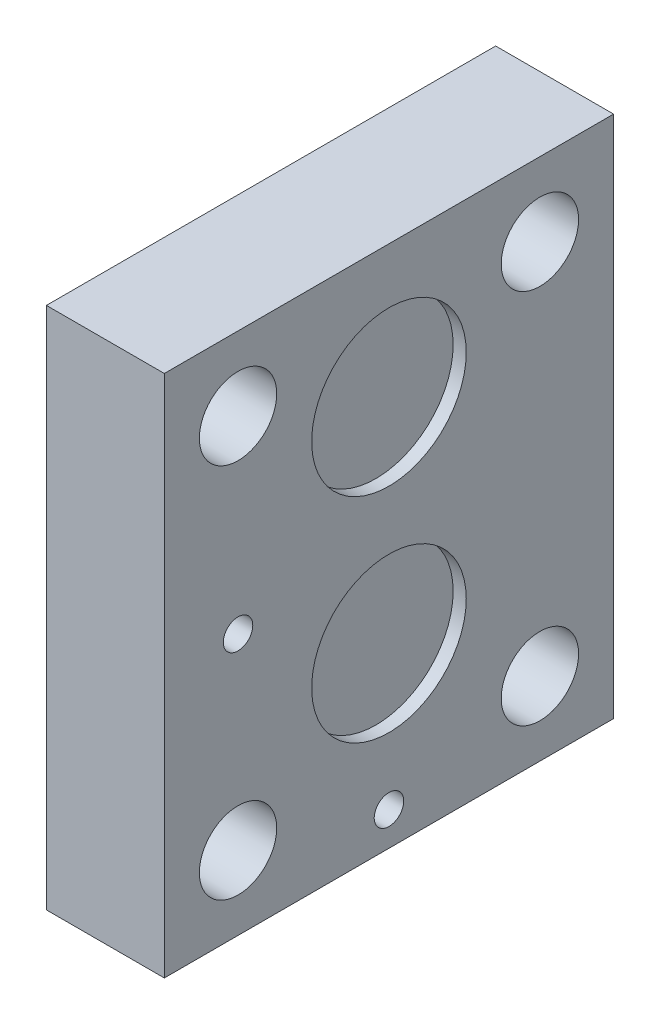
ISO-10303-21;
HEADER;
FILE_DESCRIPTION(('STEP AP214'),'2;1');
FILE_NAME('part.step','',(''),(''),'','','');
FILE_SCHEMA(('AUTOMOTIVE_DESIGN { 1 0 10303 214 1 1 1 1 }'));
ENDSEC;
DATA;
#1=APPLICATION_CONTEXT('core data for automotive mechanical design processes');
#2=APPLICATION_PROTOCOL_DEFINITION('international standard','automotive_design',2000,#1);
#3=PRODUCT_CONTEXT('',#1,'mechanical');
#4=PRODUCT('Part','Part','',(#3));
#5=PRODUCT_RELATED_PRODUCT_CATEGORY('part','',(#4));
#6=PRODUCT_DEFINITION_FORMATION('','',#4);
#7=PRODUCT_DEFINITION_CONTEXT('part definition',#1,'design');
#8=PRODUCT_DEFINITION('design','',#6,#7);
#9=PRODUCT_DEFINITION_SHAPE('','',#8);
#10=(LENGTH_UNIT() NAMED_UNIT(*) SI_UNIT(.MILLI.,.METRE.));
#11=(NAMED_UNIT(*) PLANE_ANGLE_UNIT() SI_UNIT($,.RADIAN.));
#12=(NAMED_UNIT(*) SI_UNIT($,.STERADIAN.) SOLID_ANGLE_UNIT());
#13=UNCERTAINTY_MEASURE_WITH_UNIT(LENGTH_MEASURE(1.E-05),#10,'distance_accuracy_value','');
#14=(GEOMETRIC_REPRESENTATION_CONTEXT(3) GLOBAL_UNCERTAINTY_ASSIGNED_CONTEXT((#13)) GLOBAL_UNIT_ASSIGNED_CONTEXT((#10,
#11,#12)) REPRESENTATION_CONTEXT('',''));
#15=CARTESIAN_POINT('',(0.,0.,0.));
#16=DIRECTION('',(0.,0.,1.));
#17=DIRECTION('',(1.,0.,0.));
#18=AXIS2_PLACEMENT_3D('',#15,#16,#17);
#19=CARTESIAN_POINT('',(25.4,0.,0.));
#20=DIRECTION('',(0.,1.,0.));
#21=DIRECTION('',(0.,0.,1.));
#22=AXIS2_PLACEMENT_3D('',#19,#20,#21);
#23=PLANE('',#22);
#24=DIRECTION('',(0.,0.,-1.));
#25=VECTOR('',#24,1.);
#26=CARTESIAN_POINT('',(0.,0.,0.));
#27=LINE('',#26,#25);
#28=CARTESIAN_POINT('',(0.,0.,96.774));
#29=VERTEX_POINT('',#28);
#30=CARTESIAN_POINT('',(0.,0.,0.));
#31=VERTEX_POINT('',#30);
#32=EDGE_CURVE('E106',#29,#31,#27,.T.);
#33=ORIENTED_EDGE('',*,*,#32,.T.);
#34=DIRECTION('',(-1.,0.,0.));
#35=VECTOR('',#34,1.);
#36=CARTESIAN_POINT('',(25.4,0.,0.));
#37=LINE('',#36,#35);
#38=CARTESIAN_POINT('',(25.4,0.,0.));
#39=VERTEX_POINT('',#38);
#40=EDGE_CURVE('E11',#39,#31,#37,.T.);
#41=ORIENTED_EDGE('',*,*,#40,.F.);
#42=DIRECTION('',(0.,0.,-1.));
#43=VECTOR('',#42,1.);
#44=CARTESIAN_POINT('',(25.4,0.,0.));
#45=LINE('',#44,#43);
#46=CARTESIAN_POINT('',(25.4,0.,96.774));
#47=VERTEX_POINT('',#46);
#48=EDGE_CURVE('E94',#47,#39,#45,.T.);
#49=ORIENTED_EDGE('',*,*,#48,.F.);
#50=DIRECTION('',(-1.,0.,0.));
#51=VECTOR('',#50,1.);
#52=CARTESIAN_POINT('',(25.4,0.,96.774));
#53=LINE('',#52,#51);
#54=EDGE_CURVE('E102',#47,#29,#53,.T.);
#55=ORIENTED_EDGE('',*,*,#54,.T.);
#56=EDGE_LOOP('',(#33,#41,#49,#55));
#57=FACE_BOUND('',#56,.T.);
#58=ADVANCED_FACE('F43',(#57),#23,.F.);
#59=CARTESIAN_POINT('',(25.4,0.,0.));
#60=DIRECTION('',(0.,0.,1.));
#61=DIRECTION('',(1.,0.,0.));
#62=AXIS2_PLACEMENT_3D('',#59,#60,#61);
#63=PLANE('',#62);
#64=DIRECTION('',(0.,1.,0.));
#65=VECTOR('',#64,1.);
#66=CARTESIAN_POINT('',(0.,0.,0.));
#67=LINE('',#66,#65);
#68=CARTESIAN_POINT('',(0.,112.776,0.));
#69=VERTEX_POINT('',#68);
#70=EDGE_CURVE('E98',#31,#69,#67,.T.);
#71=ORIENTED_EDGE('',*,*,#70,.T.);
#72=DIRECTION('',(-1.,0.,0.));
#73=VECTOR('',#72,1.);
#74=CARTESIAN_POINT('',(25.4,112.776,0.));
#75=LINE('',#74,#73);
#76=CARTESIAN_POINT('',(25.4,112.776,0.));
#77=VERTEX_POINT('',#76);
#78=EDGE_CURVE('E51',#77,#69,#75,.T.);
#79=ORIENTED_EDGE('',*,*,#78,.F.);
#80=DIRECTION('',(0.,1.,0.));
#81=VECTOR('',#80,1.);
#82=CARTESIAN_POINT('',(25.4,0.,0.));
#83=LINE('',#82,#81);
#84=EDGE_CURVE('E89',#39,#77,#83,.T.);
#85=ORIENTED_EDGE('',*,*,#84,.F.);
#86=ORIENTED_EDGE('',*,*,#40,.T.);
#87=EDGE_LOOP('',(#71,#79,#85,#86));
#88=FACE_BOUND('',#87,.T.);
#89=ADVANCED_FACE('F97',(#88),#63,.F.);
#90=CARTESIAN_POINT('',(25.4,112.776,0.));
#91=DIRECTION('',(0.,-1.,0.));
#92=DIRECTION('',(0.,0.,-1.));
#93=AXIS2_PLACEMENT_3D('',#90,#91,#92);
#94=PLANE('',#93);
#95=DIRECTION('',(0.,0.,1.));
#96=VECTOR('',#95,1.);
#97=CARTESIAN_POINT('',(0.,112.776,0.));
#98=LINE('',#97,#96);
#99=CARTESIAN_POINT('',(0.,112.776,96.774));
#100=VERTEX_POINT('',#99);
#101=EDGE_CURVE('E76',#69,#100,#98,.T.);
#102=ORIENTED_EDGE('',*,*,#101,.T.);
#103=DIRECTION('',(-1.,0.,0.));
#104=VECTOR('',#103,1.);
#105=CARTESIAN_POINT('',(25.4,112.776,96.774));
#106=LINE('',#105,#104);
#107=CARTESIAN_POINT('',(25.4,112.776,96.774));
#108=VERTEX_POINT('',#107);
#109=EDGE_CURVE('E99',#108,#100,#106,.T.);
#110=ORIENTED_EDGE('',*,*,#109,.F.);
#111=DIRECTION('',(0.,0.,1.));
#112=VECTOR('',#111,1.);
#113=CARTESIAN_POINT('',(25.4,112.776,0.));
#114=LINE('',#113,#112);
#115=EDGE_CURVE('E92',#77,#108,#114,.T.);
#116=ORIENTED_EDGE('',*,*,#115,.F.);
#117=ORIENTED_EDGE('',*,*,#78,.T.);
#118=EDGE_LOOP('',(#102,#110,#116,#117));
#119=FACE_BOUND('',#118,.T.);
#120=ADVANCED_FACE('F100',(#119),#94,.F.);
#121=CARTESIAN_POINT('',(25.4,0.,96.774));
#122=DIRECTION('',(0.,0.,-1.));
#123=DIRECTION('',(-1.,0.,0.));
#124=AXIS2_PLACEMENT_3D('',#121,#122,#123);
#125=PLANE('',#124);
#126=DIRECTION('',(0.,-1.,0.));
#127=VECTOR('',#126,1.);
#128=CARTESIAN_POINT('',(0.,0.,96.774));
#129=LINE('',#128,#127);
#130=EDGE_CURVE('E82',#100,#29,#129,.T.);
#131=ORIENTED_EDGE('',*,*,#130,.T.);
#132=ORIENTED_EDGE('',*,*,#54,.F.);
#133=DIRECTION('',(0.,-1.,0.));
#134=VECTOR('',#133,1.);
#135=CARTESIAN_POINT('',(25.4,0.,96.774));
#136=LINE('',#135,#134);
#137=EDGE_CURVE('E59',#108,#47,#136,.T.);
#138=ORIENTED_EDGE('',*,*,#137,.F.);
#139=ORIENTED_EDGE('',*,*,#109,.T.);
#140=EDGE_LOOP('',(#131,#132,#138,#139));
#141=FACE_BOUND('',#140,.T.);
#142=ADVANCED_FACE('F114',(#141),#125,.F.);
#143=CARTESIAN_POINT('',(25.4,0.,0.));
#144=DIRECTION('',(-1.,0.,0.));
#145=DIRECTION('',(0.,0.,1.));
#146=AXIS2_PLACEMENT_3D('',#143,#144,#145);
#147=PLANE('',#146);
#148=CARTESIAN_POINT('',(25.4,84.201,48.387));
#149=DIRECTION('',(1.,0.,0.));
#150=DIRECTION('',(0.,0.,-1.));
#151=AXIS2_PLACEMENT_3D('',#148,#149,#150);
#152=CIRCLE('',#151,16.6497);
#153=CARTESIAN_POINT('',(25.4,84.201,31.7373));
#154=VERTEX_POINT('',#153);
#155=EDGE_CURVE('E174',#154,#154,#152,.T.);
#156=ORIENTED_EDGE('',*,*,#155,.F.);
#157=EDGE_LOOP('',(#156));
#158=FACE_BOUND('',#157,.T.);
#159=CARTESIAN_POINT('',(25.4,38.227,48.387));
#160=DIRECTION('',(1.,0.,0.));
#161=DIRECTION('',(0.,0.,-1.));
#162=AXIS2_PLACEMENT_3D('',#159,#160,#161);
#163=CIRCLE('',#162,16.6497);
#164=CARTESIAN_POINT('',(25.4,38.227,31.7373));
#165=VERTEX_POINT('',#164);
#166=EDGE_CURVE('E168',#165,#165,#163,.T.);
#167=ORIENTED_EDGE('',*,*,#166,.F.);
#168=EDGE_LOOP('',(#167));
#169=FACE_BOUND('',#168,.T.);
#170=CARTESIAN_POINT('',(25.4,56.261,80.899));
#171=DIRECTION('',(1.,0.,0.));
#172=DIRECTION('',(0.,0.,-1.));
#173=AXIS2_PLACEMENT_3D('',#170,#171,#172);
#174=CIRCLE('',#173,3.175);
#175=CARTESIAN_POINT('',(25.4,56.261,77.724));
#176=VERTEX_POINT('',#175);
#177=EDGE_CURVE('E162',#176,#176,#174,.T.);
#178=ORIENTED_EDGE('',*,*,#177,.F.);
#179=EDGE_LOOP('',(#178));
#180=FACE_BOUND('',#179,.T.);
#181=CARTESIAN_POINT('',(25.4,7.239,48.387));
#182=DIRECTION('',(1.,0.,0.));
#183=DIRECTION('',(0.,0.,-1.));
#184=AXIS2_PLACEMENT_3D('',#181,#182,#183);
#185=CIRCLE('',#184,3.175);
#186=CARTESIAN_POINT('',(25.4,7.239,45.212));
#187=VERTEX_POINT('',#186);
#188=EDGE_CURVE('E156',#187,#187,#185,.T.);
#189=ORIENTED_EDGE('',*,*,#188,.F.);
#190=EDGE_LOOP('',(#189));
#191=FACE_BOUND('',#190,.T.);
#192=CARTESIAN_POINT('',(25.4,96.901,15.875));
#193=DIRECTION('',(1.,0.,0.));
#194=DIRECTION('',(0.,0.,-1.));
#195=AXIS2_PLACEMENT_3D('',#192,#193,#194);
#196=CIRCLE('',#195,8.334375);
#197=CARTESIAN_POINT('',(25.4,96.901,7.540625));
#198=VERTEX_POINT('',#197);
#199=EDGE_CURVE('E123',#198,#198,#196,.T.);
#200=ORIENTED_EDGE('',*,*,#199,.F.);
#201=EDGE_LOOP('',(#200));
#202=FACE_BOUND('',#201,.T.);
#203=CARTESIAN_POINT('',(25.4,15.875,80.899));
#204=DIRECTION('',(1.,0.,0.));
#205=DIRECTION('',(0.,0.,-1.));
#206=AXIS2_PLACEMENT_3D('',#203,#204,#205);
#207=CIRCLE('',#206,8.334375);
#208=CARTESIAN_POINT('',(25.4,15.875,72.564625));
#209=VERTEX_POINT('',#208);
#210=EDGE_CURVE('E133',#209,#209,#207,.T.);
#211=ORIENTED_EDGE('',*,*,#210,.F.);
#212=EDGE_LOOP('',(#211));
#213=FACE_BOUND('',#212,.T.);
#214=CARTESIAN_POINT('',(25.4,96.901,80.899));
#215=DIRECTION('',(1.,0.,0.));
#216=DIRECTION('',(0.,0.,-1.));
#217=AXIS2_PLACEMENT_3D('',#214,#215,#216);
#218=CIRCLE('',#217,8.33437500000001);
#219=CARTESIAN_POINT('',(25.4,96.901,72.564625));
#220=VERTEX_POINT('',#219);
#221=EDGE_CURVE('E126',#220,#220,#218,.T.);
#222=ORIENTED_EDGE('',*,*,#221,.F.);
#223=EDGE_LOOP('',(#222));
#224=FACE_BOUND('',#223,.T.);
#225=CARTESIAN_POINT('',(25.4,15.875,15.875));
#226=DIRECTION('',(1.,0.,0.));
#227=DIRECTION('',(0.,0.,-1.));
#228=AXIS2_PLACEMENT_3D('',#225,#226,#227);
#229=CIRCLE('',#228,8.334375);
#230=CARTESIAN_POINT('',(25.4,15.875,7.540625));
#231=VERTEX_POINT('',#230);
#232=EDGE_CURVE('E109',#231,#231,#229,.T.);
#233=ORIENTED_EDGE('',*,*,#232,.F.);
#234=EDGE_LOOP('',(#233));
#235=FACE_BOUND('',#234,.T.);
#236=ORIENTED_EDGE('',*,*,#48,.T.);
#237=ORIENTED_EDGE('',*,*,#84,.T.);
#238=ORIENTED_EDGE('',*,*,#115,.T.);
#239=ORIENTED_EDGE('',*,*,#137,.T.);
#240=EDGE_LOOP('',(#236,#237,#238,#239));
#241=FACE_BOUND('',#240,.T.);
#242=ADVANCED_FACE('F90',(#158,#169,#180,#191,#202,#213,#224,#235,#241),#147,.F.);
#243=CARTESIAN_POINT('',(0.,0.,0.));
#244=DIRECTION('',(-1.,0.,0.));
#245=DIRECTION('',(0.,0.,1.));
#246=AXIS2_PLACEMENT_3D('',#243,#244,#245);
#247=PLANE('',#246);
#248=CARTESIAN_POINT('',(0.,56.515,15.875));
#249=DIRECTION('',(1.,0.,0.));
#250=DIRECTION('',(0.,0.,-1.));
#251=AXIS2_PLACEMENT_3D('',#248,#249,#250);
#252=CIRCLE('',#251,3.571875);
#253=CARTESIAN_POINT('',(0.,56.515,12.303125));
#254=VERTEX_POINT('',#253);
#255=EDGE_CURVE('E150',#254,#254,#252,.T.);
#256=ORIENTED_EDGE('',*,*,#255,.T.);
#257=EDGE_LOOP('',(#256));
#258=FACE_BOUND('',#257,.T.);
#259=CARTESIAN_POINT('',(0.,105.537,48.387));
#260=DIRECTION('',(1.,0.,0.));
#261=DIRECTION('',(0.,0.,-1.));
#262=AXIS2_PLACEMENT_3D('',#259,#260,#261);
#263=CIRCLE('',#262,3.57187500000001);
#264=CARTESIAN_POINT('',(0.,105.537,44.815125));
#265=VERTEX_POINT('',#264);
#266=EDGE_CURVE('E144',#265,#265,#263,.T.);
#267=ORIENTED_EDGE('',*,*,#266,.T.);
#268=EDGE_LOOP('',(#267));
#269=FACE_BOUND('',#268,.T.);
#270=CARTESIAN_POINT('',(0.,96.901,15.875));
#271=DIRECTION('',(1.,0.,0.));
#272=DIRECTION('',(0.,0.,-1.));
#273=AXIS2_PLACEMENT_3D('',#270,#271,#272);
#274=CIRCLE('',#273,8.334375);
#275=CARTESIAN_POINT('',(0.,96.901,7.540625));
#276=VERTEX_POINT('',#275);
#277=EDGE_CURVE('E139',#276,#276,#274,.T.);
#278=ORIENTED_EDGE('',*,*,#277,.T.);
#279=EDGE_LOOP('',(#278));
#280=FACE_BOUND('',#279,.T.);
#281=CARTESIAN_POINT('',(0.,15.875,80.899));
#282=DIRECTION('',(1.,0.,0.));
#283=DIRECTION('',(0.,0.,-1.));
#284=AXIS2_PLACEMENT_3D('',#281,#282,#283);
#285=CIRCLE('',#284,8.334375);
#286=CARTESIAN_POINT('',(0.,15.875,72.564625));
#287=VERTEX_POINT('',#286);
#288=EDGE_CURVE('E136',#287,#287,#285,.T.);
#289=ORIENTED_EDGE('',*,*,#288,.T.);
#290=EDGE_LOOP('',(#289));
#291=FACE_BOUND('',#290,.T.);
#292=CARTESIAN_POINT('',(0.,96.901,80.899));
#293=DIRECTION('',(1.,0.,0.));
#294=DIRECTION('',(0.,0.,-1.));
#295=AXIS2_PLACEMENT_3D('',#292,#293,#294);
#296=CIRCLE('',#295,8.33437500000001);
#297=CARTESIAN_POINT('',(0.,96.901,72.564625));
#298=VERTEX_POINT('',#297);
#299=EDGE_CURVE('E129',#298,#298,#296,.T.);
#300=ORIENTED_EDGE('',*,*,#299,.T.);
#301=EDGE_LOOP('',(#300));
#302=FACE_BOUND('',#301,.T.);
#303=CARTESIAN_POINT('',(0.,15.875,15.875));
#304=DIRECTION('',(1.,0.,0.));
#305=DIRECTION('',(0.,0.,-1.));
#306=AXIS2_PLACEMENT_3D('',#303,#304,#305);
#307=CIRCLE('',#306,8.334375);
#308=CARTESIAN_POINT('',(0.,15.875,7.540625));
#309=VERTEX_POINT('',#308);
#310=EDGE_CURVE('E120',#309,#309,#307,.T.);
#311=ORIENTED_EDGE('',*,*,#310,.T.);
#312=EDGE_LOOP('',(#311));
#313=FACE_BOUND('',#312,.T.);
#314=ORIENTED_EDGE('',*,*,#32,.F.);
#315=ORIENTED_EDGE('',*,*,#130,.F.);
#316=ORIENTED_EDGE('',*,*,#101,.F.);
#317=ORIENTED_EDGE('',*,*,#70,.F.);
#318=EDGE_LOOP('',(#314,#315,#316,#317));
#319=FACE_BOUND('',#318,.T.);
#320=ADVANCED_FACE('F117',(#258,#269,#280,#291,#302,#313,#319),#247,.T.);
#321=CARTESIAN_POINT('',(25.4,15.875,15.875));
#322=DIRECTION('',(-1.,0.,0.));
#323=DIRECTION('',(0.,0.,1.));
#324=AXIS2_PLACEMENT_3D('',#321,#322,#323);
#325=CYLINDRICAL_SURFACE('',#324,8.334375);
#326=ORIENTED_EDGE('',*,*,#232,.T.);
#327=EDGE_LOOP('',(#326));
#328=FACE_BOUND('',#327,.T.);
#329=ORIENTED_EDGE('',*,*,#310,.F.);
#330=EDGE_LOOP('',(#329));
#331=FACE_BOUND('',#330,.T.);
#332=ADVANCED_FACE('F206',(#328,#331),#325,.F.);
#333=CARTESIAN_POINT('',(25.4,96.901,80.899));
#334=DIRECTION('',(-1.,0.,0.));
#335=DIRECTION('',(0.,0.,1.));
#336=AXIS2_PLACEMENT_3D('',#333,#334,#335);
#337=CYLINDRICAL_SURFACE('',#336,8.33437500000001);
#338=ORIENTED_EDGE('',*,*,#221,.T.);
#339=EDGE_LOOP('',(#338));
#340=FACE_BOUND('',#339,.T.);
#341=ORIENTED_EDGE('',*,*,#299,.F.);
#342=EDGE_LOOP('',(#341));
#343=FACE_BOUND('',#342,.T.);
#344=ADVANCED_FACE('F209',(#340,#343),#337,.F.);
#345=CARTESIAN_POINT('',(25.4,15.875,80.899));
#346=DIRECTION('',(-1.,0.,0.));
#347=DIRECTION('',(0.,0.,1.));
#348=AXIS2_PLACEMENT_3D('',#345,#346,#347);
#349=CYLINDRICAL_SURFACE('',#348,8.334375);
#350=ORIENTED_EDGE('',*,*,#210,.T.);
#351=EDGE_LOOP('',(#350));
#352=FACE_BOUND('',#351,.T.);
#353=ORIENTED_EDGE('',*,*,#288,.F.);
#354=EDGE_LOOP('',(#353));
#355=FACE_BOUND('',#354,.T.);
#356=ADVANCED_FACE('F248',(#352,#355),#349,.F.);
#357=CARTESIAN_POINT('',(25.4,96.901,15.875));
#358=DIRECTION('',(-1.,0.,0.));
#359=DIRECTION('',(0.,0.,1.));
#360=AXIS2_PLACEMENT_3D('',#357,#358,#359);
#361=CYLINDRICAL_SURFACE('',#360,8.334375);
#362=ORIENTED_EDGE('',*,*,#199,.T.);
#363=EDGE_LOOP('',(#362));
#364=FACE_BOUND('',#363,.T.);
#365=ORIENTED_EDGE('',*,*,#277,.F.);
#366=EDGE_LOOP('',(#365));
#367=FACE_BOUND('',#366,.T.);
#368=ADVANCED_FACE('F257',(#364,#367),#361,.F.);
#369=CARTESIAN_POINT('',(7.874,105.537,48.387));
#370=DIRECTION('',(-1.,0.,0.));
#371=DIRECTION('',(0.,0.,1.));
#372=AXIS2_PLACEMENT_3D('',#369,#370,#371);
#373=CYLINDRICAL_SURFACE('',#372,3.57187500000001);
#374=CARTESIAN_POINT('',(7.874,105.537,48.387));
#375=DIRECTION('',(1.,0.,0.));
#376=DIRECTION('',(0.,0.,-1.));
#377=AXIS2_PLACEMENT_3D('',#374,#375,#376);
#378=CIRCLE('',#377,3.57187500000001);
#379=CARTESIAN_POINT('',(7.874,105.537,44.815125));
#380=VERTEX_POINT('',#379);
#381=EDGE_CURVE('E130',#380,#380,#378,.T.);
#382=ORIENTED_EDGE('',*,*,#381,.T.);
#383=EDGE_LOOP('',(#382));
#384=FACE_BOUND('',#383,.T.);
#385=ORIENTED_EDGE('',*,*,#266,.F.);
#386=EDGE_LOOP('',(#385));
#387=FACE_BOUND('',#386,.T.);
#388=ADVANCED_FACE('F266',(#384,#387),#373,.F.);
#389=CARTESIAN_POINT('',(7.874,105.537,48.387));
#390=DIRECTION('',(1.,0.,0.));
#391=DIRECTION('',(0.,0.,-1.));
#392=AXIS2_PLACEMENT_3D('',#389,#390,#391);
#393=PLANE('',#392);
#394=ORIENTED_EDGE('',*,*,#381,.F.);
#395=EDGE_LOOP('',(#394));
#396=FACE_BOUND('',#395,.T.);
#397=ADVANCED_FACE('F274',(#396),#393,.F.);
#398=CARTESIAN_POINT('',(7.874,56.515,15.875));
#399=DIRECTION('',(-1.,0.,0.));
#400=DIRECTION('',(0.,0.,1.));
#401=AXIS2_PLACEMENT_3D('',#398,#399,#400);
#402=CYLINDRICAL_SURFACE('',#401,3.571875);
#403=CARTESIAN_POINT('',(7.874,56.515,15.875));
#404=DIRECTION('',(1.,0.,0.));
#405=DIRECTION('',(0.,0.,-1.));
#406=AXIS2_PLACEMENT_3D('',#403,#404,#405);
#407=CIRCLE('',#406,3.571875);
#408=CARTESIAN_POINT('',(7.874,56.515,12.303125));
#409=VERTEX_POINT('',#408);
#410=EDGE_CURVE('E147',#409,#409,#407,.T.);
#411=ORIENTED_EDGE('',*,*,#410,.T.);
#412=EDGE_LOOP('',(#411));
#413=FACE_BOUND('',#412,.T.);
#414=ORIENTED_EDGE('',*,*,#255,.F.);
#415=EDGE_LOOP('',(#414));
#416=FACE_BOUND('',#415,.T.);
#417=ADVANCED_FACE('F282',(#413,#416),#402,.F.);
#418=CARTESIAN_POINT('',(7.874,56.515,15.875));
#419=DIRECTION('',(1.,0.,0.));
#420=DIRECTION('',(0.,0.,-1.));
#421=AXIS2_PLACEMENT_3D('',#418,#419,#420);
#422=PLANE('',#421);
#423=ORIENTED_EDGE('',*,*,#410,.F.);
#424=EDGE_LOOP('',(#423));
#425=FACE_BOUND('',#424,.T.);
#426=ADVANCED_FACE('F294',(#425),#422,.F.);
#427=CARTESIAN_POINT('',(17.526,7.239,48.387));
#428=DIRECTION('',(1.,0.,0.));
#429=DIRECTION('',(0.,0.,-1.));
#430=AXIS2_PLACEMENT_3D('',#427,#428,#429);
#431=CYLINDRICAL_SURFACE('',#430,3.175);
#432=CARTESIAN_POINT('',(17.526,7.239,48.387));
#433=DIRECTION('',(1.,0.,0.));
#434=DIRECTION('',(0.,0.,-1.));
#435=AXIS2_PLACEMENT_3D('',#432,#433,#434);
#436=CIRCLE('',#435,3.175);
#437=CARTESIAN_POINT('',(17.526,7.239,45.212));
#438=VERTEX_POINT('',#437);
#439=EDGE_CURVE('E153',#438,#438,#436,.T.);
#440=ORIENTED_EDGE('',*,*,#439,.F.);
#441=EDGE_LOOP('',(#440));
#442=FACE_BOUND('',#441,.T.);
#443=ORIENTED_EDGE('',*,*,#188,.T.);
#444=EDGE_LOOP('',(#443));
#445=FACE_BOUND('',#444,.T.);
#446=ADVANCED_FACE('F304',(#442,#445),#431,.F.);
#447=CARTESIAN_POINT('',(17.526,7.239,48.387));
#448=DIRECTION('',(1.,0.,0.));
#449=DIRECTION('',(0.,0.,-1.));
#450=AXIS2_PLACEMENT_3D('',#447,#448,#449);
#451=PLANE('',#450);
#452=ORIENTED_EDGE('',*,*,#439,.T.);
#453=EDGE_LOOP('',(#452));
#454=FACE_BOUND('',#453,.T.);
#455=ADVANCED_FACE('F314',(#454),#451,.T.);
#456=CARTESIAN_POINT('',(17.526,56.261,80.899));
#457=DIRECTION('',(1.,0.,0.));
#458=DIRECTION('',(0.,0.,-1.));
#459=AXIS2_PLACEMENT_3D('',#456,#457,#458);
#460=CYLINDRICAL_SURFACE('',#459,3.175);
#461=CARTESIAN_POINT('',(17.526,56.261,80.899));
#462=DIRECTION('',(1.,0.,0.));
#463=DIRECTION('',(0.,0.,-1.));
#464=AXIS2_PLACEMENT_3D('',#461,#462,#463);
#465=CIRCLE('',#464,3.175);
#466=CARTESIAN_POINT('',(17.526,56.261,77.724));
#467=VERTEX_POINT('',#466);
#468=EDGE_CURVE('E159',#467,#467,#465,.T.);
#469=ORIENTED_EDGE('',*,*,#468,.F.);
#470=EDGE_LOOP('',(#469));
#471=FACE_BOUND('',#470,.T.);
#472=ORIENTED_EDGE('',*,*,#177,.T.);
#473=EDGE_LOOP('',(#472));
#474=FACE_BOUND('',#473,.T.);
#475=ADVANCED_FACE('F324',(#471,#474),#460,.F.);
#476=CARTESIAN_POINT('',(17.526,56.261,80.899));
#477=DIRECTION('',(1.,0.,0.));
#478=DIRECTION('',(0.,0.,-1.));
#479=AXIS2_PLACEMENT_3D('',#476,#477,#478);
#480=PLANE('',#479);
#481=ORIENTED_EDGE('',*,*,#468,.T.);
#482=EDGE_LOOP('',(#481));
#483=FACE_BOUND('',#482,.T.);
#484=ADVANCED_FACE('F334',(#483),#480,.T.);
#485=CARTESIAN_POINT('',(22.5806,38.227,48.387));
#486=DIRECTION('',(1.,0.,0.));
#487=DIRECTION('',(0.,0.,-1.));
#488=AXIS2_PLACEMENT_3D('',#485,#486,#487);
#489=CYLINDRICAL_SURFACE('',#488,16.6497);
#490=CARTESIAN_POINT('',(22.5806,38.227,48.387));
#491=DIRECTION('',(1.,0.,0.));
#492=DIRECTION('',(0.,0.,-1.));
#493=AXIS2_PLACEMENT_3D('',#490,#491,#492);
#494=CIRCLE('',#493,16.6497);
#495=CARTESIAN_POINT('',(22.5806,38.227,31.7373));
#496=VERTEX_POINT('',#495);
#497=EDGE_CURVE('E165',#496,#496,#494,.T.);
#498=ORIENTED_EDGE('',*,*,#497,.F.);
#499=EDGE_LOOP('',(#498));
#500=FACE_BOUND('',#499,.T.);
#501=ORIENTED_EDGE('',*,*,#166,.T.);
#502=EDGE_LOOP('',(#501));
#503=FACE_BOUND('',#502,.T.);
#504=ADVANCED_FACE('F344',(#500,#503),#489,.F.);
#505=CARTESIAN_POINT('',(22.5806,38.227,48.387));
#506=DIRECTION('',(1.,0.,0.));
#507=DIRECTION('',(0.,0.,-1.));
#508=AXIS2_PLACEMENT_3D('',#505,#506,#507);
#509=PLANE('',#508);
#510=ORIENTED_EDGE('',*,*,#497,.T.);
#511=EDGE_LOOP('',(#510));
#512=FACE_BOUND('',#511,.T.);
#513=ADVANCED_FACE('F185',(#512),#509,.T.);
#514=CARTESIAN_POINT('',(22.5806,84.201,48.387));
#515=DIRECTION('',(1.,0.,0.));
#516=DIRECTION('',(0.,0.,-1.));
#517=AXIS2_PLACEMENT_3D('',#514,#515,#516);
#518=CYLINDRICAL_SURFACE('',#517,16.6497);
#519=CARTESIAN_POINT('',(22.5806,84.201,48.387));
#520=DIRECTION('',(1.,0.,0.));
#521=DIRECTION('',(0.,0.,-1.));
#522=AXIS2_PLACEMENT_3D('',#519,#520,#521);
#523=CIRCLE('',#522,16.6497);
#524=CARTESIAN_POINT('',(22.5806,84.201,31.7373));
#525=VERTEX_POINT('',#524);
#526=EDGE_CURVE('E171',#525,#525,#523,.T.);
#527=ORIENTED_EDGE('',*,*,#526,.F.);
#528=EDGE_LOOP('',(#527));
#529=FACE_BOUND('',#528,.T.);
#530=ORIENTED_EDGE('',*,*,#155,.T.);
#531=EDGE_LOOP('',(#530));
#532=FACE_BOUND('',#531,.T.);
#533=ADVANCED_FACE('F182',(#529,#532),#518,.F.);
#534=CARTESIAN_POINT('',(22.5806,84.201,48.387));
#535=DIRECTION('',(1.,0.,0.));
#536=DIRECTION('',(0.,0.,-1.));
#537=AXIS2_PLACEMENT_3D('',#534,#535,#536);
#538=PLANE('',#537);
#539=ORIENTED_EDGE('',*,*,#526,.T.);
#540=EDGE_LOOP('',(#539));
#541=FACE_BOUND('',#540,.T.);
#542=ADVANCED_FACE('F180',(#541),#538,.T.);
#543=CLOSED_SHELL('',(#58,#89,#120,#142,#242,#320,#332,#344,#356,#368,#388,#397,#417,#426,#446,
#455,#475,#484,#504,#513,#533,#542));
#544=MANIFOLD_SOLID_BREP('B2',#543);
#545=ADVANCED_BREP_SHAPE_REPRESENTATION('',(#18,#544),#14);
#546=SHAPE_DEFINITION_REPRESENTATION(#9,#545);
ENDSEC;
END-ISO-10303-21;
